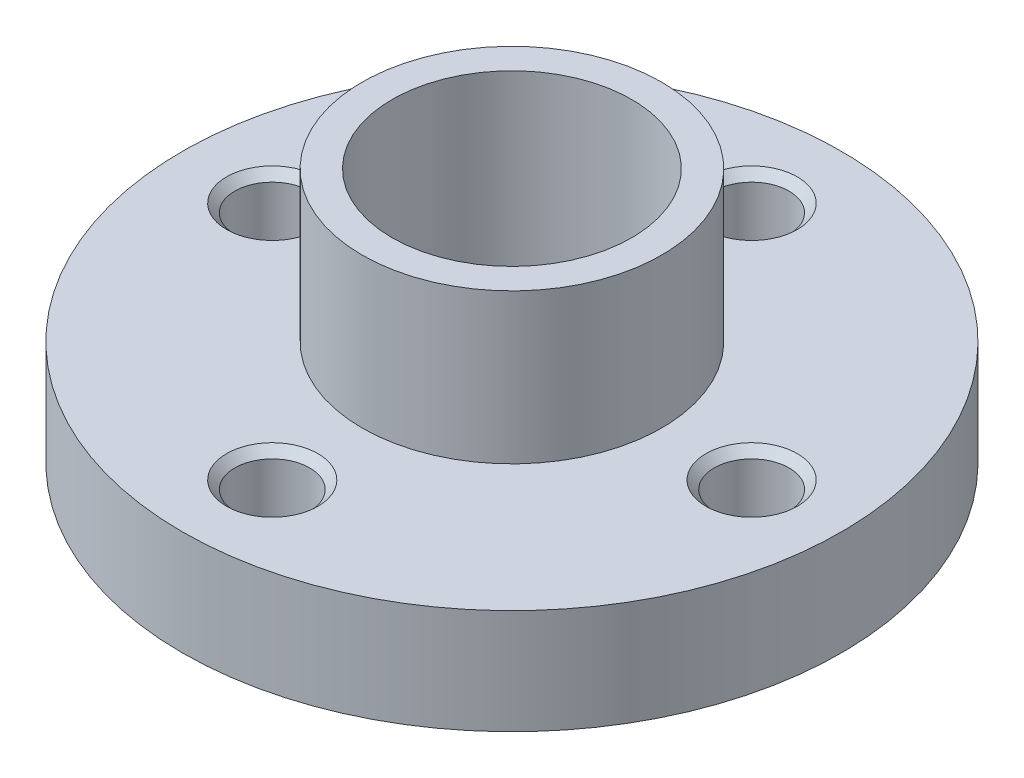
ISO-10303-21;
HEADER;
FILE_DESCRIPTION(('STEP AP214'),'2;1');
FILE_NAME('part.step','',(''),(''),'','','');
FILE_SCHEMA(('AUTOMOTIVE_DESIGN { 1 0 10303 214 1 1 1 1 }'));
ENDSEC;
DATA;
#1=APPLICATION_CONTEXT('core data for automotive mechanical design processes');
#2=APPLICATION_PROTOCOL_DEFINITION('international standard','automotive_design',2000,#1);
#3=PRODUCT_CONTEXT('',#1,'mechanical');
#4=PRODUCT('Part','Part','',(#3));
#5=PRODUCT_RELATED_PRODUCT_CATEGORY('part','',(#4));
#6=PRODUCT_DEFINITION_FORMATION('','',#4);
#7=PRODUCT_DEFINITION_CONTEXT('part definition',#1,'design');
#8=PRODUCT_DEFINITION('design','',#6,#7);
#9=PRODUCT_DEFINITION_SHAPE('','',#8);
#10=(LENGTH_UNIT() NAMED_UNIT(*) SI_UNIT(.MILLI.,.METRE.));
#11=(NAMED_UNIT(*) PLANE_ANGLE_UNIT() SI_UNIT($,.RADIAN.));
#12=(NAMED_UNIT(*) SI_UNIT($,.STERADIAN.) SOLID_ANGLE_UNIT());
#13=UNCERTAINTY_MEASURE_WITH_UNIT(LENGTH_MEASURE(1.E-05),#10,'distance_accuracy_value','');
#14=(GEOMETRIC_REPRESENTATION_CONTEXT(3) GLOBAL_UNCERTAINTY_ASSIGNED_CONTEXT((#13)) GLOBAL_UNIT_ASSIGNED_CONTEXT((#10,
#11,#12)) REPRESENTATION_CONTEXT('',''));
#15=CARTESIAN_POINT('',(0.,0.,0.));
#16=DIRECTION('',(0.,0.,1.));
#17=DIRECTION('',(1.,0.,0.));
#18=AXIS2_PLACEMENT_3D('',#15,#16,#17);
#19=CARTESIAN_POINT('',(0.,3.5,0.));
#20=DIRECTION('',(0.,-1.,0.));
#21=DIRECTION('',(0.,0.,-1.));
#22=AXIS2_PLACEMENT_3D('',#19,#20,#21);
#23=CYLINDRICAL_SURFACE('',#22,11.);
#24=CARTESIAN_POINT('',(0.,3.5,0.));
#25=DIRECTION('',(0.,1.,0.));
#26=DIRECTION('',(0.,0.,1.));
#27=AXIS2_PLACEMENT_3D('',#24,#25,#26);
#28=CIRCLE('',#27,11.);
#29=CARTESIAN_POINT('',(0.,3.5,11.));
#30=VERTEX_POINT('',#29);
#31=EDGE_CURVE('E45',#30,#30,#28,.T.);
#32=ORIENTED_EDGE('',*,*,#31,.F.);
#33=EDGE_LOOP('',(#32));
#34=FACE_BOUND('',#33,.T.);
#35=CARTESIAN_POINT('',(0.,0.,0.));
#36=DIRECTION('',(0.,1.,0.));
#37=DIRECTION('',(0.,0.,1.));
#38=AXIS2_PLACEMENT_3D('',#35,#36,#37);
#39=CIRCLE('',#38,11.);
#40=CARTESIAN_POINT('',(0.,0.,11.));
#41=VERTEX_POINT('',#40);
#42=EDGE_CURVE('E50',#41,#41,#39,.T.);
#43=ORIENTED_EDGE('',*,*,#42,.T.);
#44=EDGE_LOOP('',(#43));
#45=FACE_BOUND('',#44,.T.);
#46=ADVANCED_FACE('F38',(#34,#45),#23,.T.);
#47=CARTESIAN_POINT('',(0.,3.5,0.));
#48=DIRECTION('',(0.,1.,0.));
#49=DIRECTION('',(0.,0.,1.));
#50=AXIS2_PLACEMENT_3D('',#47,#48,#49);
#51=PLANE('',#50);
#52=CARTESIAN_POINT('',(0.,3.5,-8.));
#53=DIRECTION('',(0.,1.,0.));
#54=DIRECTION('',(0.,0.,1.));
#55=AXIS2_PLACEMENT_3D('',#52,#53,#54);
#56=CIRCLE('',#55,1.525);
#57=CARTESIAN_POINT('',(0.,3.5,-6.475));
#58=VERTEX_POINT('',#57);
#59=EDGE_CURVE('E189',#58,#58,#56,.T.);
#60=ORIENTED_EDGE('',*,*,#59,.F.);
#61=EDGE_LOOP('',(#60));
#62=FACE_BOUND('',#61,.T.);
#63=CARTESIAN_POINT('',(8.,3.5,0.));
#64=DIRECTION('',(0.,1.,0.));
#65=DIRECTION('',(0.,0.,1.));
#66=AXIS2_PLACEMENT_3D('',#63,#64,#65);
#67=CIRCLE('',#66,1.525);
#68=CARTESIAN_POINT('',(8.,3.5,1.525));
#69=VERTEX_POINT('',#68);
#70=EDGE_CURVE('E79',#69,#69,#67,.T.);
#71=ORIENTED_EDGE('',*,*,#70,.F.);
#72=EDGE_LOOP('',(#71));
#73=FACE_BOUND('',#72,.T.);
#74=CARTESIAN_POINT('',(0.,3.5,8.));
#75=DIRECTION('',(0.,1.,0.));
#76=DIRECTION('',(0.,0.,1.));
#77=AXIS2_PLACEMENT_3D('',#74,#75,#76);
#78=CIRCLE('',#77,1.525);
#79=CARTESIAN_POINT('',(0.,3.5,9.525));
#80=VERTEX_POINT('',#79);
#81=EDGE_CURVE('E72',#80,#80,#78,.T.);
#82=ORIENTED_EDGE('',*,*,#81,.F.);
#83=EDGE_LOOP('',(#82));
#84=FACE_BOUND('',#83,.T.);
#85=CARTESIAN_POINT('',(-8.,3.5,0.));
#86=DIRECTION('',(0.,1.,0.));
#87=DIRECTION('',(0.,0.,1.));
#88=AXIS2_PLACEMENT_3D('',#85,#86,#87);
#89=CIRCLE('',#88,1.525);
#90=CARTESIAN_POINT('',(-8.,3.5,1.525));
#91=VERTEX_POINT('',#90);
#92=EDGE_CURVE('E68',#91,#91,#89,.T.);
#93=ORIENTED_EDGE('',*,*,#92,.F.);
#94=EDGE_LOOP('',(#93));
#95=FACE_BOUND('',#94,.T.);
#96=CARTESIAN_POINT('',(0.,3.5,0.));
#97=DIRECTION('',(0.,1.,0.));
#98=DIRECTION('',(0.,0.,1.));
#99=AXIS2_PLACEMENT_3D('',#96,#97,#98);
#100=CIRCLE('',#99,5.);
#101=CARTESIAN_POINT('',(0.,3.5,5.));
#102=VERTEX_POINT('',#101);
#103=EDGE_CURVE('E10',#102,#102,#100,.T.);
#104=ORIENTED_EDGE('',*,*,#103,.F.);
#105=EDGE_LOOP('',(#104));
#106=FACE_BOUND('',#105,.T.);
#107=ORIENTED_EDGE('',*,*,#31,.T.);
#108=EDGE_LOOP('',(#107));
#109=FACE_BOUND('',#108,.T.);
#110=ADVANCED_FACE('F118',(#62,#73,#84,#95,#106,#109),#51,.T.);
#111=CARTESIAN_POINT('',(0.,0.,0.));
#112=DIRECTION('',(0.,1.,0.));
#113=DIRECTION('',(0.,0.,1.));
#114=AXIS2_PLACEMENT_3D('',#111,#112,#113);
#115=PLANE('',#114);
#116=CARTESIAN_POINT('',(0.,0.,-8.));
#117=DIRECTION('',(0.,1.,0.));
#118=DIRECTION('',(0.,0.,1.));
#119=AXIS2_PLACEMENT_3D('',#116,#117,#118);
#120=CIRCLE('',#119,1.24999999999999);
#121=CARTESIAN_POINT('',(0.,0.,-6.75000000000001));
#122=VERTEX_POINT('',#121);
#123=EDGE_CURVE('E41',#122,#122,#120,.T.);
#124=ORIENTED_EDGE('',*,*,#123,.T.);
#125=EDGE_LOOP('',(#124));
#126=FACE_BOUND('',#125,.T.);
#127=CARTESIAN_POINT('',(8.,0.,0.));
#128=DIRECTION('',(0.,1.,0.));
#129=DIRECTION('',(0.,0.,1.));
#130=AXIS2_PLACEMENT_3D('',#127,#128,#129);
#131=CIRCLE('',#130,1.24999999999999);
#132=CARTESIAN_POINT('',(8.,0.,1.24999999999999));
#133=VERTEX_POINT('',#132);
#134=EDGE_CURVE('E70',#133,#133,#131,.T.);
#135=ORIENTED_EDGE('',*,*,#134,.T.);
#136=EDGE_LOOP('',(#135));
#137=FACE_BOUND('',#136,.T.);
#138=CARTESIAN_POINT('',(0.,0.,8.));
#139=DIRECTION('',(0.,1.,0.));
#140=DIRECTION('',(0.,0.,1.));
#141=AXIS2_PLACEMENT_3D('',#138,#139,#140);
#142=CIRCLE('',#141,1.24999999999999);
#143=CARTESIAN_POINT('',(0.,0.,9.24999999999999));
#144=VERTEX_POINT('',#143);
#145=EDGE_CURVE('E66',#144,#144,#142,.T.);
#146=ORIENTED_EDGE('',*,*,#145,.T.);
#147=EDGE_LOOP('',(#146));
#148=FACE_BOUND('',#147,.T.);
#149=CARTESIAN_POINT('',(-8.,0.,0.));
#150=DIRECTION('',(0.,1.,0.));
#151=DIRECTION('',(0.,0.,1.));
#152=AXIS2_PLACEMENT_3D('',#149,#150,#151);
#153=CIRCLE('',#152,1.24999999999999);
#154=CARTESIAN_POINT('',(-8.,0.,1.25));
#155=VERTEX_POINT('',#154);
#156=EDGE_CURVE('E61',#155,#155,#153,.T.);
#157=ORIENTED_EDGE('',*,*,#156,.T.);
#158=EDGE_LOOP('',(#157));
#159=FACE_BOUND('',#158,.T.);
#160=CARTESIAN_POINT('',(0.,0.,0.));
#161=DIRECTION('',(0.,1.,0.));
#162=DIRECTION('',(0.,0.,1.));
#163=AXIS2_PLACEMENT_3D('',#160,#161,#162);
#164=CIRCLE('',#163,5.);
#165=CARTESIAN_POINT('',(0.,0.,5.));
#166=VERTEX_POINT('',#165);
#167=EDGE_CURVE('E58',#166,#166,#164,.T.);
#168=ORIENTED_EDGE('',*,*,#167,.T.);
#169=EDGE_LOOP('',(#168));
#170=FACE_BOUND('',#169,.T.);
#171=ORIENTED_EDGE('',*,*,#42,.F.);
#172=EDGE_LOOP('',(#171));
#173=FACE_BOUND('',#172,.T.);
#174=ADVANCED_FACE('F109',(#126,#137,#148,#159,#170,#173),#115,.F.);
#175=CARTESIAN_POINT('',(0.,-2.,0.));
#176=DIRECTION('',(0.,1.,0.));
#177=DIRECTION('',(0.,0.,1.));
#178=AXIS2_PLACEMENT_3D('',#175,#176,#177);
#179=PLANE('',#178);
#180=CARTESIAN_POINT('',(0.,-2.,0.));
#181=DIRECTION('',(0.,1.,0.));
#182=DIRECTION('',(0.,0.,1.));
#183=AXIS2_PLACEMENT_3D('',#180,#181,#182);
#184=CIRCLE('',#183,4.);
#185=CARTESIAN_POINT('',(0.,-2.,4.));
#186=VERTEX_POINT('',#185);
#187=EDGE_CURVE('E93',#186,#186,#184,.T.);
#188=ORIENTED_EDGE('',*,*,#187,.T.);
#189=EDGE_LOOP('',(#188));
#190=FACE_BOUND('',#189,.T.);
#191=CARTESIAN_POINT('',(0.,-2.,0.));
#192=DIRECTION('',(0.,1.,0.));
#193=DIRECTION('',(0.,0.,1.));
#194=AXIS2_PLACEMENT_3D('',#191,#192,#193);
#195=CIRCLE('',#194,5.);
#196=CARTESIAN_POINT('',(0.,-2.,5.));
#197=VERTEX_POINT('',#196);
#198=EDGE_CURVE('E53',#197,#197,#195,.T.);
#199=ORIENTED_EDGE('',*,*,#198,.F.);
#200=EDGE_LOOP('',(#199));
#201=FACE_BOUND('',#200,.T.);
#202=ADVANCED_FACE('F107',(#190,#201),#179,.F.);
#203=CARTESIAN_POINT('',(0.,-2.,0.));
#204=DIRECTION('',(0.,1.,0.));
#205=DIRECTION('',(0.,0.,1.));
#206=AXIS2_PLACEMENT_3D('',#203,#204,#205);
#207=CYLINDRICAL_SURFACE('',#206,5.);
#208=ORIENTED_EDGE('',*,*,#198,.T.);
#209=EDGE_LOOP('',(#208));
#210=FACE_BOUND('',#209,.T.);
#211=ORIENTED_EDGE('',*,*,#167,.F.);
#212=EDGE_LOOP('',(#211));
#213=FACE_BOUND('',#212,.T.);
#214=ADVANCED_FACE('F104',(#210,#213),#207,.T.);
#215=ORIENTED_EDGE('',*,*,#103,.T.);
#216=EDGE_LOOP('',(#215));
#217=FACE_BOUND('',#216,.T.);
#218=CARTESIAN_POINT('',(0.,8.5,0.));
#219=DIRECTION('',(0.,1.,0.));
#220=DIRECTION('',(0.,0.,1.));
#221=AXIS2_PLACEMENT_3D('',#218,#219,#220);
#222=CIRCLE('',#221,5.);
#223=CARTESIAN_POINT('',(0.,8.5,5.));
#224=VERTEX_POINT('',#223);
#225=EDGE_CURVE('E96',#224,#224,#222,.T.);
#226=ORIENTED_EDGE('',*,*,#225,.F.);
#227=EDGE_LOOP('',(#226));
#228=FACE_BOUND('',#227,.T.);
#229=ADVANCED_FACE('F116',(#217,#228),#207,.T.);
#230=CARTESIAN_POINT('',(0.,8.5,0.));
#231=DIRECTION('',(0.,1.,0.));
#232=DIRECTION('',(0.,0.,1.));
#233=AXIS2_PLACEMENT_3D('',#230,#231,#232);
#234=PLANE('',#233);
#235=CARTESIAN_POINT('',(0.,8.5,0.));
#236=DIRECTION('',(0.,1.,0.));
#237=DIRECTION('',(0.,0.,1.));
#238=AXIS2_PLACEMENT_3D('',#235,#236,#237);
#239=CIRCLE('',#238,4.);
#240=CARTESIAN_POINT('',(0.,8.5,4.));
#241=VERTEX_POINT('',#240);
#242=EDGE_CURVE('E64',#241,#241,#239,.T.);
#243=ORIENTED_EDGE('',*,*,#242,.F.);
#244=EDGE_LOOP('',(#243));
#245=FACE_BOUND('',#244,.T.);
#246=ORIENTED_EDGE('',*,*,#225,.T.);
#247=EDGE_LOOP('',(#246));
#248=FACE_BOUND('',#247,.T.);
#249=ADVANCED_FACE('F138',(#245,#248),#234,.T.);
#250=CARTESIAN_POINT('',(0.,-2.,0.));
#251=DIRECTION('',(0.,1.,0.));
#252=DIRECTION('',(0.,0.,1.));
#253=AXIS2_PLACEMENT_3D('',#250,#251,#252);
#254=CYLINDRICAL_SURFACE('',#253,4.);
#255=CARTESIAN_POINT('',(0.,-2.,4.));
#256=CARTESIAN_POINT('',(0.,-1.890625,4.));
#257=CARTESIAN_POINT('',(0.,-1.78125,4.));
#258=CARTESIAN_POINT('',(0.,-1.5625,4.));
#259=CARTESIAN_POINT('',(0.,-1.453125,4.));
#260=CARTESIAN_POINT('',(0.,-1.234375,4.));
#261=CARTESIAN_POINT('',(0.,-1.125,4.));
#262=CARTESIAN_POINT('',(0.,-0.90625,4.));
#263=CARTESIAN_POINT('',(0.,-0.796875,4.));
#264=CARTESIAN_POINT('',(0.,-0.578125,4.));
#265=CARTESIAN_POINT('',(0.,-0.46875,4.));
#266=CARTESIAN_POINT('',(0.,-0.25,4.));
#267=CARTESIAN_POINT('',(0.,-0.140625,4.));
#268=CARTESIAN_POINT('',(0.,0.0781249999999995,4.));
#269=CARTESIAN_POINT('',(0.,0.187499999999999,4.));
#270=CARTESIAN_POINT('',(0.,0.40625,4.));
#271=CARTESIAN_POINT('',(0.,0.515625,4.));
#272=CARTESIAN_POINT('',(0.,0.734375,4.));
#273=CARTESIAN_POINT('',(0.,0.84375,4.));
#274=CARTESIAN_POINT('',(0.,1.0625,4.));
#275=CARTESIAN_POINT('',(0.,1.171875,4.));
#276=CARTESIAN_POINT('',(0.,1.390625,4.));
#277=CARTESIAN_POINT('',(0.,1.5,4.));
#278=CARTESIAN_POINT('',(0.,1.71875,4.));
#279=CARTESIAN_POINT('',(0.,1.828125,4.));
#280=CARTESIAN_POINT('',(0.,2.046875,4.));
#281=CARTESIAN_POINT('',(0.,2.15625,4.));
#282=CARTESIAN_POINT('',(0.,2.375,4.));
#283=CARTESIAN_POINT('',(0.,2.484375,4.));
#284=CARTESIAN_POINT('',(0.,2.703125,4.));
#285=CARTESIAN_POINT('',(0.,2.8125,4.));
#286=CARTESIAN_POINT('',(0.,3.03125,4.));
#287=CARTESIAN_POINT('',(0.,3.140625,4.));
#288=CARTESIAN_POINT('',(0.,3.359375,4.));
#289=CARTESIAN_POINT('',(0.,3.46875,4.));
#290=CARTESIAN_POINT('',(0.,3.6875,4.));
#291=CARTESIAN_POINT('',(0.,3.796875,4.));
#292=CARTESIAN_POINT('',(0.,4.015625,4.));
#293=CARTESIAN_POINT('',(0.,4.125,4.));
#294=CARTESIAN_POINT('',(0.,4.34375,4.));
#295=CARTESIAN_POINT('',(0.,4.453125,4.));
#296=CARTESIAN_POINT('',(0.,4.671875,4.));
#297=CARTESIAN_POINT('',(0.,4.78125,4.));
#298=CARTESIAN_POINT('',(0.,5.,4.));
#299=CARTESIAN_POINT('',(0.,5.109375,4.));
#300=CARTESIAN_POINT('',(0.,5.328125,4.));
#301=CARTESIAN_POINT('',(0.,5.4375,4.));
#302=CARTESIAN_POINT('',(0.,5.65625,4.));
#303=CARTESIAN_POINT('',(0.,5.765625,4.));
#304=CARTESIAN_POINT('',(0.,5.984375,4.));
#305=CARTESIAN_POINT('',(0.,6.09375,4.));
#306=CARTESIAN_POINT('',(0.,6.3125,4.));
#307=CARTESIAN_POINT('',(0.,6.421875,4.));
#308=CARTESIAN_POINT('',(0.,6.640625,4.));
#309=CARTESIAN_POINT('',(0.,6.75,4.));
#310=CARTESIAN_POINT('',(0.,6.96875,4.));
#311=CARTESIAN_POINT('',(0.,7.078125,4.));
#312=CARTESIAN_POINT('',(0.,7.296875,4.));
#313=CARTESIAN_POINT('',(0.,7.40625,4.));
#314=CARTESIAN_POINT('',(0.,7.625,4.));
#315=CARTESIAN_POINT('',(0.,7.734375,4.));
#316=CARTESIAN_POINT('',(0.,7.953125,4.));
#317=CARTESIAN_POINT('',(0.,8.0625,4.));
#318=CARTESIAN_POINT('',(0.,8.28125,4.));
#319=CARTESIAN_POINT('',(0.,8.390625,4.));
#320=CARTESIAN_POINT('',(0.,8.5,4.));
#321=B_SPLINE_CURVE_WITH_KNOTS('',3,(#255,#256,#257,#258,#259,#260,#261,#262,#263,#264,#265,
#266,#267,#268,#269,#270,#271,#272,#273,#274,#275,#276,#277,#278,#279,#280,#281,#282,#283,#284,
#285,#286,#287,#288,#289,#290,#291,#292,#293,#294,#295,#296,#297,#298,#299,#300,#301,#302,#303,
#304,#305,#306,#307,#308,#309,#310,#311,#312,#313,#314,#315,#316,#317,#318,#319,#320),
.UNSPECIFIED.,.F.,.F.,(4,2,2,2,2,2,2,2,2,2,2,2,2,2,2,2,2,2,2,2,2,2,2,2,2,2,2,2,2,2,2,2,4),(0.,
0.328125,0.65625,0.984375,1.3125,1.640625,1.96875,2.296875,2.625,2.953125,3.28125,3.609375,
3.9375,4.265625,4.59375,4.921875,5.25,5.578125,5.90625,6.234375,6.5625,6.890625,7.21875,
7.546875,7.875,8.203125,8.53125,8.859375,9.1875,9.515625,9.84375,10.171875,10.5),.UNSPECIFIED.);
#322=EDGE_CURVE('BSEAM142',#186,#241,#321,.T.);
#323=ORIENTED_EDGE('',*,*,#187,.F.);
#324=ORIENTED_EDGE('',*,*,#242,.T.);
#325=ORIENTED_EDGE('',*,*,#322,.T.);
#326=ORIENTED_EDGE('',*,*,#322,.F.);
#327=EDGE_LOOP('',(#323,#325,#324,#326));
#328=FACE_BOUND('',#327,.T.);
#329=ADVANCED_FACE('F142',(#328),#254,.F.);
#330=CARTESIAN_POINT('',(-8.,3.5,0.));
#331=DIRECTION('',(0.,1.,0.));
#332=DIRECTION('',(0.,0.,1.));
#333=AXIS2_PLACEMENT_3D('',#330,#331,#332);
#334=CYLINDRICAL_SURFACE('',#333,1.24999999999999);
#335=CARTESIAN_POINT('',(-8.,3.225,0.));
#336=DIRECTION('',(0.,1.,0.));
#337=DIRECTION('',(0.,0.,1.));
#338=AXIS2_PLACEMENT_3D('',#335,#336,#337);
#339=CIRCLE('',#338,1.25);
#340=CARTESIAN_POINT('',(-8.,3.225,1.25));
#341=VERTEX_POINT('',#340);
#342=EDGE_CURVE('E65',#341,#341,#339,.T.);
#343=ORIENTED_EDGE('',*,*,#342,.T.);
#344=EDGE_LOOP('',(#343));
#345=FACE_BOUND('',#344,.T.);
#346=ORIENTED_EDGE('',*,*,#156,.F.);
#347=EDGE_LOOP('',(#346));
#348=FACE_BOUND('',#347,.T.);
#349=ADVANCED_FACE('F148',(#345,#348),#334,.F.);
#350=CARTESIAN_POINT('',(-8.,3.5,0.));
#351=DIRECTION('',(0.,1.,0.));
#352=DIRECTION('',(0.,0.,1.));
#353=AXIS2_PLACEMENT_3D('',#350,#351,#352);
#354=CONICAL_SURFACE('',#353,1.525,0.785398163397445);
#355=ORIENTED_EDGE('',*,*,#342,.F.);
#356=EDGE_LOOP('',(#355));
#357=FACE_BOUND('',#356,.T.);
#358=ORIENTED_EDGE('',*,*,#92,.T.);
#359=EDGE_LOOP('',(#358));
#360=FACE_BOUND('',#359,.T.);
#361=ADVANCED_FACE('F155',(#357,#360),#354,.F.);
#362=CARTESIAN_POINT('',(0.,3.5,8.));
#363=DIRECTION('',(0.,1.,0.));
#364=DIRECTION('',(0.,0.,1.));
#365=AXIS2_PLACEMENT_3D('',#362,#363,#364);
#366=CYLINDRICAL_SURFACE('',#365,1.24999999999999);
#367=CARTESIAN_POINT('',(0.,3.225,8.));
#368=DIRECTION('',(0.,1.,0.));
#369=DIRECTION('',(0.,0.,1.));
#370=AXIS2_PLACEMENT_3D('',#367,#368,#369);
#371=CIRCLE('',#370,1.25);
#372=CARTESIAN_POINT('',(0.,3.225,9.25));
#373=VERTEX_POINT('',#372);
#374=EDGE_CURVE('E69',#373,#373,#371,.T.);
#375=ORIENTED_EDGE('',*,*,#374,.T.);
#376=EDGE_LOOP('',(#375));
#377=FACE_BOUND('',#376,.T.);
#378=ORIENTED_EDGE('',*,*,#145,.F.);
#379=EDGE_LOOP('',(#378));
#380=FACE_BOUND('',#379,.T.);
#381=ADVANCED_FACE('F159',(#377,#380),#366,.F.);
#382=CARTESIAN_POINT('',(0.,3.5,8.));
#383=DIRECTION('',(0.,1.,0.));
#384=DIRECTION('',(0.,0.,1.));
#385=AXIS2_PLACEMENT_3D('',#382,#383,#384);
#386=CONICAL_SURFACE('',#385,1.525,0.785398163397446);
#387=ORIENTED_EDGE('',*,*,#374,.F.);
#388=EDGE_LOOP('',(#387));
#389=FACE_BOUND('',#388,.T.);
#390=ORIENTED_EDGE('',*,*,#81,.T.);
#391=EDGE_LOOP('',(#390));
#392=FACE_BOUND('',#391,.T.);
#393=ADVANCED_FACE('F163',(#389,#392),#386,.F.);
#394=CARTESIAN_POINT('',(8.,3.5,0.));
#395=DIRECTION('',(0.,1.,0.));
#396=DIRECTION('',(0.,0.,1.));
#397=AXIS2_PLACEMENT_3D('',#394,#395,#396);
#398=CYLINDRICAL_SURFACE('',#397,1.24999999999999);
#399=CARTESIAN_POINT('',(8.,3.225,0.));
#400=DIRECTION('',(0.,1.,0.));
#401=DIRECTION('',(0.,0.,1.));
#402=AXIS2_PLACEMENT_3D('',#399,#400,#401);
#403=CIRCLE('',#402,1.25);
#404=CARTESIAN_POINT('',(8.,3.225,1.25));
#405=VERTEX_POINT('',#404);
#406=EDGE_CURVE('E73',#405,#405,#403,.T.);
#407=ORIENTED_EDGE('',*,*,#406,.T.);
#408=EDGE_LOOP('',(#407));
#409=FACE_BOUND('',#408,.T.);
#410=ORIENTED_EDGE('',*,*,#134,.F.);
#411=EDGE_LOOP('',(#410));
#412=FACE_BOUND('',#411,.T.);
#413=ADVANCED_FACE('F167',(#409,#412),#398,.F.);
#414=CARTESIAN_POINT('',(8.,3.5,0.));
#415=DIRECTION('',(0.,1.,0.));
#416=DIRECTION('',(0.,0.,1.));
#417=AXIS2_PLACEMENT_3D('',#414,#415,#416);
#418=CONICAL_SURFACE('',#417,1.525,0.785398163397445);
#419=ORIENTED_EDGE('',*,*,#406,.F.);
#420=EDGE_LOOP('',(#419));
#421=FACE_BOUND('',#420,.T.);
#422=ORIENTED_EDGE('',*,*,#70,.T.);
#423=EDGE_LOOP('',(#422));
#424=FACE_BOUND('',#423,.T.);
#425=ADVANCED_FACE('F171',(#421,#424),#418,.F.);
#426=CARTESIAN_POINT('',(0.,3.5,-8.));
#427=DIRECTION('',(0.,1.,0.));
#428=DIRECTION('',(0.,0.,1.));
#429=AXIS2_PLACEMENT_3D('',#426,#427,#428);
#430=CYLINDRICAL_SURFACE('',#429,1.24999999999999);
#431=CARTESIAN_POINT('',(0.,3.225,-8.));
#432=DIRECTION('',(0.,1.,0.));
#433=DIRECTION('',(0.,0.,1.));
#434=AXIS2_PLACEMENT_3D('',#431,#432,#433);
#435=CIRCLE('',#434,1.25);
#436=CARTESIAN_POINT('',(0.,3.225,-6.75));
#437=VERTEX_POINT('',#436);
#438=EDGE_CURVE('E187',#437,#437,#435,.T.);
#439=ORIENTED_EDGE('',*,*,#438,.T.);
#440=EDGE_LOOP('',(#439));
#441=FACE_BOUND('',#440,.T.);
#442=ORIENTED_EDGE('',*,*,#123,.F.);
#443=EDGE_LOOP('',(#442));
#444=FACE_BOUND('',#443,.T.);
#445=ADVANCED_FACE('F174',(#441,#444),#430,.F.);
#446=CARTESIAN_POINT('',(0.,3.5,-8.));
#447=DIRECTION('',(0.,1.,0.));
#448=DIRECTION('',(0.,0.,1.));
#449=AXIS2_PLACEMENT_3D('',#446,#447,#448);
#450=CONICAL_SURFACE('',#449,1.525,0.785398163397446);
#451=ORIENTED_EDGE('',*,*,#438,.F.);
#452=EDGE_LOOP('',(#451));
#453=FACE_BOUND('',#452,.T.);
#454=ORIENTED_EDGE('',*,*,#59,.T.);
#455=EDGE_LOOP('',(#454));
#456=FACE_BOUND('',#455,.T.);
#457=ADVANCED_FACE('F178',(#453,#456),#450,.F.);
#458=CLOSED_SHELL('',(#46,#110,#174,#202,#214,#229,#249,#329,#349,#361,#381,#393,#413,#425,#445,#457));
#459=MANIFOLD_SOLID_BREP('B2',#458);
#460=ADVANCED_BREP_SHAPE_REPRESENTATION('',(#18,#459),#14);
#461=SHAPE_DEFINITION_REPRESENTATION(#9,#460);
ENDSEC;
END-ISO-10303-21;
